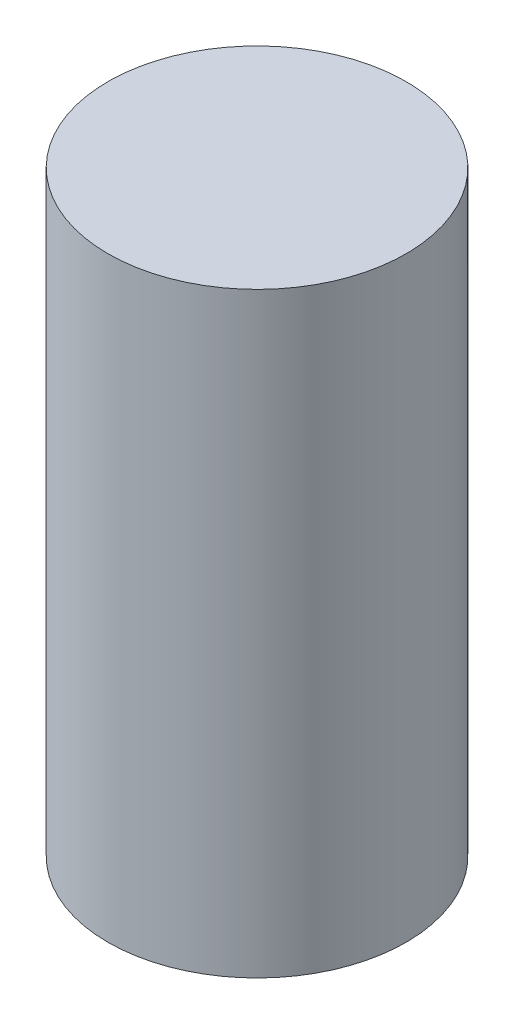
ISO-10303-21;
HEADER;
FILE_DESCRIPTION(('STEP AP214'),'2;1');
FILE_NAME('part.step','',(''),(''),'','','');
FILE_SCHEMA(('AUTOMOTIVE_DESIGN { 1 0 10303 214 1 1 1 1 }'));
ENDSEC;
DATA;
#1=APPLICATION_CONTEXT('core data for automotive mechanical design processes');
#2=APPLICATION_PROTOCOL_DEFINITION('international standard','automotive_design',2000,#1);
#3=PRODUCT_CONTEXT('',#1,'mechanical');
#4=PRODUCT('Part','Part','',(#3));
#5=PRODUCT_RELATED_PRODUCT_CATEGORY('part','',(#4));
#6=PRODUCT_DEFINITION_FORMATION('','',#4);
#7=PRODUCT_DEFINITION_CONTEXT('part definition',#1,'design');
#8=PRODUCT_DEFINITION('design','',#6,#7);
#9=PRODUCT_DEFINITION_SHAPE('','',#8);
#10=(LENGTH_UNIT() NAMED_UNIT(*) SI_UNIT(.MILLI.,.METRE.));
#11=(NAMED_UNIT(*) PLANE_ANGLE_UNIT() SI_UNIT($,.RADIAN.));
#12=(NAMED_UNIT(*) SI_UNIT($,.STERADIAN.) SOLID_ANGLE_UNIT());
#13=UNCERTAINTY_MEASURE_WITH_UNIT(LENGTH_MEASURE(1.E-05),#10,'distance_accuracy_value','');
#14=(GEOMETRIC_REPRESENTATION_CONTEXT(3) GLOBAL_UNCERTAINTY_ASSIGNED_CONTEXT((#13)) GLOBAL_UNIT_ASSIGNED_CONTEXT((#10,
#11,#12)) REPRESENTATION_CONTEXT('',''));
#15=CARTESIAN_POINT('',(0.,0.,0.));
#16=DIRECTION('',(0.,0.,1.));
#17=DIRECTION('',(1.,0.,0.));
#18=AXIS2_PLACEMENT_3D('',#15,#16,#17);
#19=CARTESIAN_POINT('',(0.,40.,0.));
#20=DIRECTION('',(0.,-1.,0.));
#21=DIRECTION('',(0.,0.,-1.));
#22=AXIS2_PLACEMENT_3D('',#19,#20,#21);
#23=CYLINDRICAL_SURFACE('',#22,10.);
#24=CARTESIAN_POINT('',(-9.68245836551854,20.,-2.5));
#25=CARTESIAN_POINT('',(-9.6824610008786,20.1380507509266,-2.49999607859307));
#26=CARTESIAN_POINT('',(-9.68544306014597,20.2761448986785,-2.48852624549765));
#27=CARTESIAN_POINT('',(-9.69701861992564,20.5483675781735,-2.44302312546379));
#28=CARTESIAN_POINT('',(-9.7056153862163,20.6824937544682,-2.4089767067421));
#29=CARTESIAN_POINT('',(-9.7273872459615,20.9428035381872,-2.31949119963204));
#30=CARTESIAN_POINT('',(-9.74055642690458,21.0689971553857,-2.26407972785449));
#31=CARTESIAN_POINT('',(-9.76998192028759,21.3103108525399,-2.13352114126138));
#32=CARTESIAN_POINT('',(-9.78623836378489,21.4254304620802,-2.05837318856069));
#33=CARTESIAN_POINT('',(-9.82040716355625,21.6438616452622,-1.88870842731188));
#34=CARTESIAN_POINT('',(-9.83834597623034,21.74689360035,-1.79383688770405));
#35=CARTESIAN_POINT('',(-9.87362875515294,21.9357613943603,-1.58818206410066));
#36=CARTESIAN_POINT('',(-9.89097266566388,22.0215956256217,-1.47739729418031));
#37=CARTESIAN_POINT('',(-9.92340415520582,22.1747754676313,-1.24114520107896));
#38=CARTESIAN_POINT('',(-9.93845687400592,22.2418463881615,-1.11549457619512));
#39=CARTESIAN_POINT('',(-9.96430811925984,22.3538096441531,-0.854263184292763));
#40=CARTESIAN_POINT('',(-9.97510727334345,22.3987052519155,-0.71868388579194));
#41=CARTESIAN_POINT('',(-9.9910475884818,22.4641478345786,-0.444358758754161));
#42=CARTESIAN_POINT('',(-9.99629893844314,22.4851696443266,-0.305732719548975));
#43=CARTESIAN_POINT('',(-10.000935941073,22.5037583792756,-0.0268288192627692));
#44=CARTESIAN_POINT('',(-10.000322460967,22.5013287722096,0.113448794538068));
#45=CARTESIAN_POINT('',(-9.99338094953534,22.4734251497499,0.388380617930968));
#46=CARTESIAN_POINT('',(-9.98718002340871,22.4484636749461,0.523090539002668));
#47=CARTESIAN_POINT('',(-9.96990836524857,22.3770287299515,0.786345618534216));
#48=CARTESIAN_POINT('',(-9.95883737398452,22.3305541146226,0.914890448426095));
#49=CARTESIAN_POINT('',(-9.93287509700884,22.2169974293129,1.16351675875452));
#50=CARTESIAN_POINT('',(-9.91795019695011,22.1497329553383,1.28351127441626));
#51=CARTESIAN_POINT('',(-9.88589903809692,21.9966443208837,1.51068905585122));
#52=CARTESIAN_POINT('',(-9.8687723965265,21.9108169314394,1.61787008771377));
#53=CARTESIAN_POINT('',(-9.83363713769356,21.7202912580176,1.81943508771239));
#54=CARTESIAN_POINT('',(-9.81561719525297,21.6151451076523,1.91339419768799));
#55=CARTESIAN_POINT('',(-9.78115043517327,21.3904000264597,2.08244093990755));
#56=CARTESIAN_POINT('',(-9.76470369108289,21.2708004205089,2.15752769011507));
#57=CARTESIAN_POINT('',(-9.73520496829319,21.0197099658511,2.28697032255647));
#58=CARTESIAN_POINT('',(-9.72216983717007,20.8881642696872,2.34122391742612));
#59=CARTESIAN_POINT('',(-9.70118640148669,20.6174145319232,2.42671405159095));
#60=CARTESIAN_POINT('',(-9.69323700842733,20.4782121360154,2.45795551638266));
#61=CARTESIAN_POINT('',(-9.68355356007457,20.2000404984701,2.49582963866592));
#62=CARTESIAN_POINT('',(-9.68166088976933,20.061162206659,2.50309047391912));
#63=CARTESIAN_POINT('',(-9.68387343364692,19.7841780634147,2.49451699051516));
#64=CARTESIAN_POINT('',(-9.687978095703,19.6460721420506,2.4786847978498));
#65=CARTESIAN_POINT('',(-9.7015708198498,19.3768857350514,2.42492546393825));
#66=CARTESIAN_POINT('',(-9.71096970242532,19.2457272734308,2.3873640682819));
#67=CARTESIAN_POINT('',(-9.73400718262805,18.9915685421467,2.29161808167046));
#68=CARTESIAN_POINT('',(-9.74764628246408,18.8685692409442,2.2334310477125));
#69=CARTESIAN_POINT('',(-9.77796137095511,18.6315587221331,2.0967706679366));
#70=CARTESIAN_POINT('',(-9.79469168607245,18.517771159957,2.01792175383564));
#71=CARTESIAN_POINT('',(-9.82917083071113,18.3048116371985,1.84265073233613));
#72=CARTESIAN_POINT('',(-9.84691982728307,18.2056420833499,1.7462257370136));
#73=CARTESIAN_POINT('',(-9.88197403031774,18.0221889574291,1.53565680246182));
#74=CARTESIAN_POINT('',(-9.8992570206188,17.9383399374512,1.42112988132898));
#75=CARTESIAN_POINT('',(-9.93097216613689,17.7910641330487,1.17925670673669));
#76=CARTESIAN_POINT('',(-9.94540447003949,17.7276362833918,1.05191112239398));
#77=CARTESIAN_POINT('',(-9.96970115738325,17.6235539654721,0.788895504327727));
#78=CARTESIAN_POINT('',(-9.97959830022409,17.5827357156209,0.653293452569706));
#79=CARTESIAN_POINT('',(-9.99385293395789,17.5245396653916,0.376874400797018));
#80=CARTESIAN_POINT('',(-9.99821149393422,17.507157341261,0.236058412603102));
#81=CARTESIAN_POINT('',(-10.0008542352202,17.4965810260612,-0.0427088161083076));
#82=CARTESIAN_POINT('',(-9.99929947199971,17.5027457272615,-0.180634567415054));
#83=CARTESIAN_POINT('',(-9.99064741143608,17.5376195682359,-0.453418741036876));
#84=CARTESIAN_POINT('',(-9.98355027892922,17.5663280375329,-0.588277254452321));
#85=CARTESIAN_POINT('',(-9.96463582134723,17.6451305494272,-0.850427589111936));
#86=CARTESIAN_POINT('',(-9.95284411255981,17.6951086332859,-0.977756236452159));
#87=CARTESIAN_POINT('',(-9.92578222284145,17.8149264475489,-1.22229263260406));
#88=CARTESIAN_POINT('',(-9.91051160346894,17.8847686816762,-1.33949910316408));
#89=CARTESIAN_POINT('',(-9.87768124200718,18.0442880849903,-1.56350482105826));
#90=CARTESIAN_POINT('',(-9.86007542354161,18.1344003572596,-1.66998747074584));
#91=CARTESIAN_POINT('',(-9.82476622642974,18.3310571299434,-1.86653755068376));
#92=CARTESIAN_POINT('',(-9.80706282418256,18.4376057902779,-1.95660081269148));
#93=CARTESIAN_POINT('',(-9.77318689613756,18.6665035354737,-2.11940506617958));
#94=CARTESIAN_POINT('',(-9.75704909183222,18.7891103084131,-2.19179154854095));
#95=CARTESIAN_POINT('',(-9.7285988873707,19.045138724687,-2.31481724146367));
#96=CARTESIAN_POINT('',(-9.71628370583034,19.1785524152346,-2.36547227438038));
#97=CARTESIAN_POINT('',(-9.69879771876843,19.4264425295879,-2.43605632142751));
#98=CARTESIAN_POINT('',(-9.69271657508747,19.5397329109653,-2.4599829264922));
#99=CARTESIAN_POINT('',(-9.6845459645655,19.7686721724942,-2.49195573142942));
#100=CARTESIAN_POINT('',(-9.6824561572277,19.884320850611,-2.50000328592938));
#101=CARTESIAN_POINT('',(-9.68245836551854,20.,-2.5));
#102=B_SPLINE_CURVE_WITH_KNOTS('',3,(#24,#25,#26,#27,#28,#29,#30,#31,#32,#33,#34,#35,#36,#37,
#38,#39,#40,#41,#42,#43,#44,#45,#46,#47,#48,#49,#50,#51,#52,#53,#54,#55,#56,#57,#58,#59,#60,#61,
#62,#63,#64,#65,#66,#67,#68,#69,#70,#71,#72,#73,#74,#75,#76,#77,#78,#79,#80,#81,#82,#83,#84,#85,
#86,#87,#88,#89,#90,#91,#92,#93,#94,#95,#96,#97,#98,#99,#100,#101),.UNSPECIFIED.,.T.,.F.,(4,2,2,
2,2,2,2,2,2,2,2,2,2,2,2,2,2,2,2,2,2,2,2,2,2,2,2,2,2,2,2,2,2,2,2,2,2,2,4),(0.,0.413727441736139,
0.827695741428666,1.24113072716602,1.65458326755478,2.07623954192976,2.49793521479867,
2.9255149639792,3.35303159847092,3.77188750995347,4.1906814866602,4.60018262688947,
5.00970556724786,5.42292874254445,5.83622385468913,6.26070466571912,6.68520531199802,
7.11176432008402,7.53823200129547,7.95343574764204,8.36860127188747,8.77697405014151,
9.18539521426362,9.60182845864102,10.0183301888999,10.4452533097026,10.872154157245,
11.2959207281187,11.7196054891398,12.131834461324,12.5440511738193,12.9540487656466,
13.3640980574302,13.7839709658702,14.2039503157045,14.6317647729113,15.0592672137501,
15.4059782718572,15.7526597510792),.UNSPECIFIED.);
#103=CARTESIAN_POINT('',(-9.68245836551854,20.,-2.5));
#104=VERTEX_POINT('',#103);
#105=EDGE_CURVE('E38',#104,#104,#102,.T.);
#106=ORIENTED_EDGE('',*,*,#105,.T.);
#107=EDGE_LOOP('',(#106));
#108=FACE_BOUND('',#107,.T.);
#109=CARTESIAN_POINT('',(0.,40.,0.));
#110=DIRECTION('',(0.,1.,0.));
#111=DIRECTION('',(0.,0.,1.));
#112=AXIS2_PLACEMENT_3D('',#109,#110,#111);
#113=CIRCLE('',#112,10.);
#114=CARTESIAN_POINT('',(0.,40.,10.));
#115=VERTEX_POINT('',#114);
#116=EDGE_CURVE('E10',#115,#115,#113,.T.);
#117=ORIENTED_EDGE('',*,*,#116,.F.);
#118=EDGE_LOOP('',(#117));
#119=FACE_BOUND('',#118,.T.);
#120=CARTESIAN_POINT('',(0.,0.,0.));
#121=DIRECTION('',(0.,1.,0.));
#122=DIRECTION('',(0.,0.,1.));
#123=AXIS2_PLACEMENT_3D('',#120,#121,#122);
#124=CIRCLE('',#123,10.);
#125=CARTESIAN_POINT('',(0.,0.,10.));
#126=VERTEX_POINT('',#125);
#127=EDGE_CURVE('E46',#126,#126,#124,.T.);
#128=ORIENTED_EDGE('',*,*,#127,.T.);
#129=EDGE_LOOP('',(#128));
#130=FACE_BOUND('',#129,.T.);
#131=ADVANCED_FACE('F34',(#108,#119,#130),#23,.T.);
#132=CARTESIAN_POINT('',(0.,40.,0.));
#133=DIRECTION('',(0.,1.,0.));
#134=DIRECTION('',(0.,0.,1.));
#135=AXIS2_PLACEMENT_3D('',#132,#133,#134);
#136=PLANE('',#135);
#137=ORIENTED_EDGE('',*,*,#116,.T.);
#138=EDGE_LOOP('',(#137));
#139=FACE_BOUND('',#138,.T.);
#140=ADVANCED_FACE('F71',(#139),#136,.T.);
#141=CARTESIAN_POINT('',(0.,0.,0.));
#142=DIRECTION('',(0.,1.,0.));
#143=DIRECTION('',(0.,0.,1.));
#144=AXIS2_PLACEMENT_3D('',#141,#142,#143);
#145=PLANE('',#144);
#146=ORIENTED_EDGE('',*,*,#127,.F.);
#147=EDGE_LOOP('',(#146));
#148=FACE_BOUND('',#147,.T.);
#149=ADVANCED_FACE('F64',(#148),#145,.F.);
#150=CARTESIAN_POINT('',(-40.,20.,0.));
#151=DIRECTION('',(1.,0.,0.));
#152=DIRECTION('',(0.,0.,-1.));
#153=AXIS2_PLACEMENT_3D('',#150,#151,#152);
#154=CYLINDRICAL_SURFACE('',#153,2.5);
#155=CARTESIAN_POINT('',(0.,20.,0.));
#156=DIRECTION('',(1.,0.,0.));
#157=DIRECTION('',(0.,0.,-1.));
#158=AXIS2_PLACEMENT_3D('',#155,#156,#157);
#159=CIRCLE('',#158,2.5);
#160=CARTESIAN_POINT('',(0.,20.,-2.5));
#161=VERTEX_POINT('',#160);
#162=EDGE_CURVE('E52',#161,#161,#159,.T.);
#163=ORIENTED_EDGE('',*,*,#162,.T.);
#164=EDGE_LOOP('',(#163));
#165=FACE_BOUND('',#164,.T.);
#166=ORIENTED_EDGE('',*,*,#105,.F.);
#167=EDGE_LOOP('',(#166));
#168=FACE_BOUND('',#167,.T.);
#169=ADVANCED_FACE('F61',(#165,#168),#154,.F.);
#170=CARTESIAN_POINT('',(0.,20.,0.));
#171=DIRECTION('',(1.,0.,0.));
#172=DIRECTION('',(0.,0.,-1.));
#173=AXIS2_PLACEMENT_3D('',#170,#171,#172);
#174=PLANE('',#173);
#175=ORIENTED_EDGE('',*,*,#162,.F.);
#176=EDGE_LOOP('',(#175));
#177=FACE_BOUND('',#176,.T.);
#178=ADVANCED_FACE('F63',(#177),#174,.F.);
#179=CLOSED_SHELL('',(#131,#140,#149,#169,#178));
#180=MANIFOLD_SOLID_BREP('B2',#179);
#181=ADVANCED_BREP_SHAPE_REPRESENTATION('',(#18,#180),#14);
#182=SHAPE_DEFINITION_REPRESENTATION(#9,#181);
ENDSEC;
END-ISO-10303-21;
